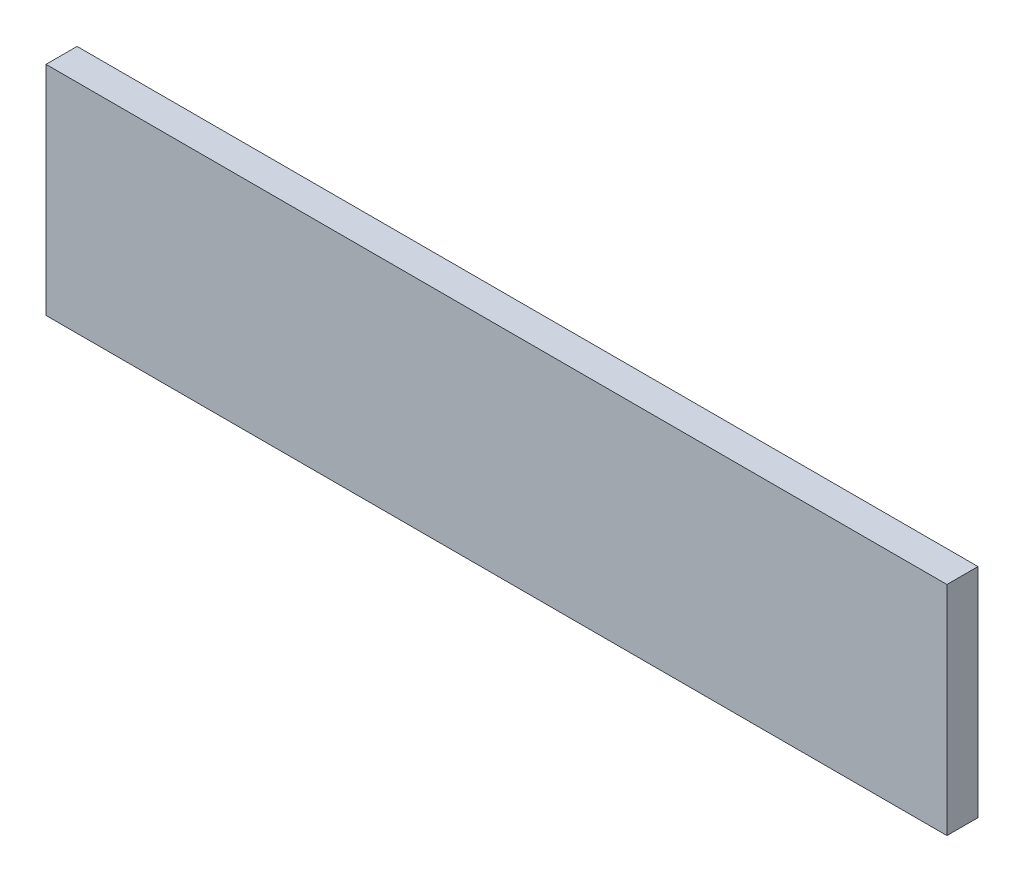
ISO-10303-21;
HEADER;
FILE_DESCRIPTION(('STEP AP214'),'2;1');
FILE_NAME('part.step','',(''),(''),'','','');
FILE_SCHEMA(('AUTOMOTIVE_DESIGN { 1 0 10303 214 1 1 1 1 }'));
ENDSEC;
DATA;
#1=APPLICATION_CONTEXT('core data for automotive mechanical design processes');
#2=APPLICATION_PROTOCOL_DEFINITION('international standard','automotive_design',2000,#1);
#3=PRODUCT_CONTEXT('',#1,'mechanical');
#4=PRODUCT('Part','Part','',(#3));
#5=PRODUCT_RELATED_PRODUCT_CATEGORY('part','',(#4));
#6=PRODUCT_DEFINITION_FORMATION('','',#4);
#7=PRODUCT_DEFINITION_CONTEXT('part definition',#1,'design');
#8=PRODUCT_DEFINITION('design','',#6,#7);
#9=PRODUCT_DEFINITION_SHAPE('','',#8);
#10=(LENGTH_UNIT() NAMED_UNIT(*) SI_UNIT(.MILLI.,.METRE.));
#11=(NAMED_UNIT(*) PLANE_ANGLE_UNIT() SI_UNIT($,.RADIAN.));
#12=(NAMED_UNIT(*) SI_UNIT($,.STERADIAN.) SOLID_ANGLE_UNIT());
#13=UNCERTAINTY_MEASURE_WITH_UNIT(LENGTH_MEASURE(1.E-05),#10,'distance_accuracy_value','');
#14=(GEOMETRIC_REPRESENTATION_CONTEXT(3) GLOBAL_UNCERTAINTY_ASSIGNED_CONTEXT((#13)) GLOBAL_UNIT_ASSIGNED_CONTEXT((#10,
#11,#12)) REPRESENTATION_CONTEXT('',''));
#15=CARTESIAN_POINT('',(0.,0.,0.));
#16=DIRECTION('',(0.,0.,1.));
#17=DIRECTION('',(1.,0.,0.));
#18=AXIS2_PLACEMENT_3D('',#15,#16,#17);
#19=CARTESIAN_POINT('',(92.075,44.45,3.175));
#20=DIRECTION('',(0.,-1.,0.));
#21=DIRECTION('',(1.,0.,0.));
#22=AXIS2_PLACEMENT_3D('',#19,#20,#21);
#23=PLANE('',#22);
#24=DIRECTION('',(-1.,0.,0.));
#25=VECTOR('',#24,1.);
#26=CARTESIAN_POINT('',(92.075,44.45,-3.175));
#27=LINE('',#26,#25);
#28=CARTESIAN_POINT('',(92.075,44.45,-3.175));
#29=VERTEX_POINT('',#28);
#30=CARTESIAN_POINT('',(-92.075,44.45,-3.175));
#31=VERTEX_POINT('',#30);
#32=EDGE_CURVE('E98',#29,#31,#27,.T.);
#33=ORIENTED_EDGE('',*,*,#32,.T.);
#34=DIRECTION('',(0.,0.,-1.));
#35=VECTOR('',#34,1.);
#36=CARTESIAN_POINT('',(-92.075,44.45,3.175));
#37=LINE('',#36,#35);
#38=CARTESIAN_POINT('',(-92.075,44.45,3.175));
#39=VERTEX_POINT('',#38);
#40=EDGE_CURVE('E11',#39,#31,#37,.T.);
#41=ORIENTED_EDGE('',*,*,#40,.F.);
#42=DIRECTION('',(-1.,0.,0.));
#43=VECTOR('',#42,1.);
#44=CARTESIAN_POINT('',(92.075,44.45,3.175));
#45=LINE('',#44,#43);
#46=CARTESIAN_POINT('',(92.075,44.45,3.175));
#47=VERTEX_POINT('',#46);
#48=EDGE_CURVE('E86',#47,#39,#45,.T.);
#49=ORIENTED_EDGE('',*,*,#48,.F.);
#50=DIRECTION('',(0.,0.,-1.));
#51=VECTOR('',#50,1.);
#52=CARTESIAN_POINT('',(92.075,44.45,3.175));
#53=LINE('',#52,#51);
#54=EDGE_CURVE('E94',#47,#29,#53,.T.);
#55=ORIENTED_EDGE('',*,*,#54,.T.);
#56=EDGE_LOOP('',(#33,#41,#49,#55));
#57=FACE_BOUND('',#56,.T.);
#58=ADVANCED_FACE('F35',(#57),#23,.F.);
#59=CARTESIAN_POINT('',(-92.075,44.45,3.175));
#60=DIRECTION('',(1.,0.,0.));
#61=DIRECTION('',(0.,0.,-1.));
#62=AXIS2_PLACEMENT_3D('',#59,#60,#61);
#63=PLANE('',#62);
#64=DIRECTION('',(0.,-1.,0.));
#65=VECTOR('',#64,1.);
#66=CARTESIAN_POINT('',(-92.075,44.45,-3.175));
#67=LINE('',#66,#65);
#68=CARTESIAN_POINT('',(-92.075,0.,-3.175));
#69=VERTEX_POINT('',#68);
#70=EDGE_CURVE('E90',#31,#69,#67,.T.);
#71=ORIENTED_EDGE('',*,*,#70,.T.);
#72=DIRECTION('',(0.,0.,-1.));
#73=VECTOR('',#72,1.);
#74=CARTESIAN_POINT('',(-92.075,0.,3.175));
#75=LINE('',#74,#73);
#76=CARTESIAN_POINT('',(-92.075,0.,3.175));
#77=VERTEX_POINT('',#76);
#78=EDGE_CURVE('E43',#77,#69,#75,.T.);
#79=ORIENTED_EDGE('',*,*,#78,.F.);
#80=DIRECTION('',(0.,-1.,0.));
#81=VECTOR('',#80,1.);
#82=CARTESIAN_POINT('',(-92.075,44.45,3.175));
#83=LINE('',#82,#81);
#84=EDGE_CURVE('E81',#39,#77,#83,.T.);
#85=ORIENTED_EDGE('',*,*,#84,.F.);
#86=ORIENTED_EDGE('',*,*,#40,.T.);
#87=EDGE_LOOP('',(#71,#79,#85,#86));
#88=FACE_BOUND('',#87,.T.);
#89=ADVANCED_FACE('F89',(#88),#63,.F.);
#90=CARTESIAN_POINT('',(-92.075,0.,3.175));
#91=DIRECTION('',(0.,1.,0.));
#92=DIRECTION('',(-1.,0.,0.));
#93=AXIS2_PLACEMENT_3D('',#90,#91,#92);
#94=PLANE('',#93);
#95=DIRECTION('',(1.,0.,0.));
#96=VECTOR('',#95,1.);
#97=CARTESIAN_POINT('',(-92.075,0.,-3.175));
#98=LINE('',#97,#96);
#99=CARTESIAN_POINT('',(92.075,0.,-3.175));
#100=VERTEX_POINT('',#99);
#101=EDGE_CURVE('E68',#69,#100,#98,.T.);
#102=ORIENTED_EDGE('',*,*,#101,.T.);
#103=DIRECTION('',(0.,0.,-1.));
#104=VECTOR('',#103,1.);
#105=CARTESIAN_POINT('',(92.075,0.,3.175));
#106=LINE('',#105,#104);
#107=CARTESIAN_POINT('',(92.075,0.,3.175));
#108=VERTEX_POINT('',#107);
#109=EDGE_CURVE('E91',#108,#100,#106,.T.);
#110=ORIENTED_EDGE('',*,*,#109,.F.);
#111=DIRECTION('',(1.,0.,0.));
#112=VECTOR('',#111,1.);
#113=CARTESIAN_POINT('',(-92.075,0.,3.175));
#114=LINE('',#113,#112);
#115=EDGE_CURVE('E84',#77,#108,#114,.T.);
#116=ORIENTED_EDGE('',*,*,#115,.F.);
#117=ORIENTED_EDGE('',*,*,#78,.T.);
#118=EDGE_LOOP('',(#102,#110,#116,#117));
#119=FACE_BOUND('',#118,.T.);
#120=ADVANCED_FACE('F92',(#119),#94,.F.);
#121=CARTESIAN_POINT('',(92.075,0.,3.175));
#122=DIRECTION('',(-1.,0.,0.));
#123=DIRECTION('',(0.,-1.,0.));
#124=AXIS2_PLACEMENT_3D('',#121,#122,#123);
#125=PLANE('',#124);
#126=DIRECTION('',(0.,1.,0.));
#127=VECTOR('',#126,1.);
#128=CARTESIAN_POINT('',(92.075,0.,-3.175));
#129=LINE('',#128,#127);
#130=EDGE_CURVE('E74',#100,#29,#129,.T.);
#131=ORIENTED_EDGE('',*,*,#130,.T.);
#132=ORIENTED_EDGE('',*,*,#54,.F.);
#133=DIRECTION('',(0.,1.,0.));
#134=VECTOR('',#133,1.);
#135=CARTESIAN_POINT('',(92.075,0.,3.175));
#136=LINE('',#135,#134);
#137=EDGE_CURVE('E51',#108,#47,#136,.T.);
#138=ORIENTED_EDGE('',*,*,#137,.F.);
#139=ORIENTED_EDGE('',*,*,#109,.T.);
#140=EDGE_LOOP('',(#131,#132,#138,#139));
#141=FACE_BOUND('',#140,.T.);
#142=ADVANCED_FACE('F105',(#141),#125,.F.);
#143=CARTESIAN_POINT('',(0.,0.,3.175));
#144=DIRECTION('',(0.,0.,1.));
#145=DIRECTION('',(1.,0.,0.));
#146=AXIS2_PLACEMENT_3D('',#143,#144,#145);
#147=PLANE('',#146);
#148=ORIENTED_EDGE('',*,*,#48,.T.);
#149=ORIENTED_EDGE('',*,*,#84,.T.);
#150=ORIENTED_EDGE('',*,*,#115,.T.);
#151=ORIENTED_EDGE('',*,*,#137,.T.);
#152=EDGE_LOOP('',(#148,#149,#150,#151));
#153=FACE_BOUND('',#152,.T.);
#154=ADVANCED_FACE('F82',(#153),#147,.T.);
#155=CARTESIAN_POINT('',(0.,0.,-3.175));
#156=DIRECTION('',(0.,0.,1.));
#157=DIRECTION('',(1.,0.,0.));
#158=AXIS2_PLACEMENT_3D('',#155,#156,#157);
#159=PLANE('',#158);
#160=ORIENTED_EDGE('',*,*,#32,.F.);
#161=ORIENTED_EDGE('',*,*,#130,.F.);
#162=ORIENTED_EDGE('',*,*,#101,.F.);
#163=ORIENTED_EDGE('',*,*,#70,.F.);
#164=EDGE_LOOP('',(#160,#161,#162,#163));
#165=FACE_BOUND('',#164,.T.);
#166=ADVANCED_FACE('F108',(#165),#159,.F.);
#167=CLOSED_SHELL('',(#58,#89,#120,#142,#154,#166));
#168=MANIFOLD_SOLID_BREP('B2',#167);
#169=ADVANCED_BREP_SHAPE_REPRESENTATION('',(#18,#168),#14);
#170=SHAPE_DEFINITION_REPRESENTATION(#9,#169);
ENDSEC;
END-ISO-10303-21;
